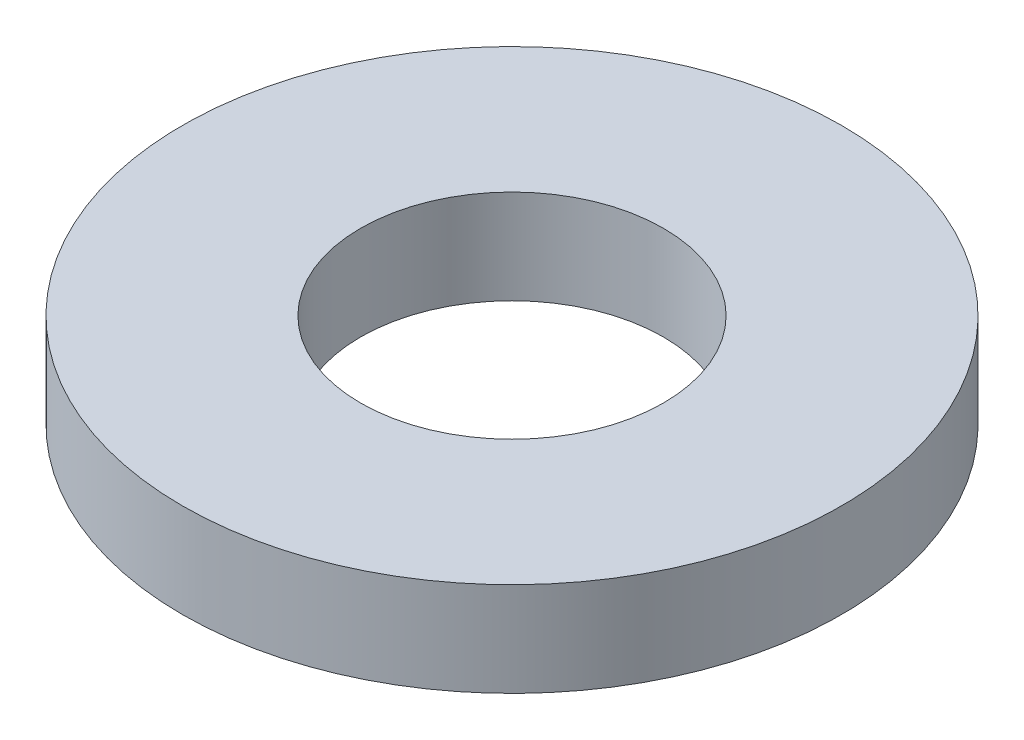
ISO-10303-21;
HEADER;
FILE_DESCRIPTION(('STEP AP214'),'2;1');
FILE_NAME('part.step','',(''),(''),'','','');
FILE_SCHEMA(('AUTOMOTIVE_DESIGN { 1 0 10303 214 1 1 1 1 }'));
ENDSEC;
DATA;
#1=APPLICATION_CONTEXT('core data for automotive mechanical design processes');
#2=APPLICATION_PROTOCOL_DEFINITION('international standard','automotive_design',2000,#1);
#3=PRODUCT_CONTEXT('',#1,'mechanical');
#4=PRODUCT('Part','Part','',(#3));
#5=PRODUCT_RELATED_PRODUCT_CATEGORY('part','',(#4));
#6=PRODUCT_DEFINITION_FORMATION('','',#4);
#7=PRODUCT_DEFINITION_CONTEXT('part definition',#1,'design');
#8=PRODUCT_DEFINITION('design','',#6,#7);
#9=PRODUCT_DEFINITION_SHAPE('','',#8);
#10=(LENGTH_UNIT() NAMED_UNIT(*) SI_UNIT(.MILLI.,.METRE.));
#11=(NAMED_UNIT(*) PLANE_ANGLE_UNIT() SI_UNIT($,.RADIAN.));
#12=(NAMED_UNIT(*) SI_UNIT($,.STERADIAN.) SOLID_ANGLE_UNIT());
#13=UNCERTAINTY_MEASURE_WITH_UNIT(LENGTH_MEASURE(1.E-05),#10,'distance_accuracy_value','');
#14=(GEOMETRIC_REPRESENTATION_CONTEXT(3) GLOBAL_UNCERTAINTY_ASSIGNED_CONTEXT((#13)) GLOBAL_UNIT_ASSIGNED_CONTEXT((#10,
#11,#12)) REPRESENTATION_CONTEXT('',''));
#15=CARTESIAN_POINT('',(0.,0.,0.));
#16=DIRECTION('',(0.,0.,1.));
#17=DIRECTION('',(1.,0.,0.));
#18=AXIS2_PLACEMENT_3D('',#15,#16,#17);
#19=CARTESIAN_POINT('',(0.,1.5875,0.));
#20=DIRECTION('',(0.,1.,0.));
#21=DIRECTION('',(0.,0.,1.));
#22=AXIS2_PLACEMENT_3D('',#19,#20,#21);
#23=PLANE('',#22);
#24=CARTESIAN_POINT('',(0.,1.5875,0.));
#25=DIRECTION('',(0.,1.,0.));
#26=DIRECTION('',(0.,0.,1.));
#27=AXIS2_PLACEMENT_3D('',#24,#25,#26);
#28=CIRCLE('',#27,5.55625);
#29=CARTESIAN_POINT('',(0.,1.5875,5.55625));
#30=VERTEX_POINT('',#29);
#31=EDGE_CURVE('E10',#30,#30,#28,.T.);
#32=ORIENTED_EDGE('',*,*,#31,.T.);
#33=EDGE_LOOP('',(#32));
#34=FACE_BOUND('',#33,.T.);
#35=CARTESIAN_POINT('',(0.,1.5875,0.));
#36=DIRECTION('',(0.,1.,0.));
#37=DIRECTION('',(0.,0.,1.));
#38=AXIS2_PLACEMENT_3D('',#35,#36,#37);
#39=CIRCLE('',#38,2.5527);
#40=CARTESIAN_POINT('',(0.,1.5875,2.5527));
#41=VERTEX_POINT('',#40);
#42=EDGE_CURVE('E56',#41,#41,#39,.T.);
#43=ORIENTED_EDGE('',*,*,#42,.F.);
#44=EDGE_LOOP('',(#43));
#45=FACE_BOUND('',#44,.T.);
#46=ADVANCED_FACE('F43',(#34,#45),#23,.T.);
#47=CARTESIAN_POINT('',(0.,0.,0.));
#48=DIRECTION('',(0.,1.,0.));
#49=DIRECTION('',(0.,0.,1.));
#50=AXIS2_PLACEMENT_3D('',#47,#48,#49);
#51=PLANE('',#50);
#52=CARTESIAN_POINT('',(0.,0.,0.));
#53=DIRECTION('',(0.,1.,0.));
#54=DIRECTION('',(0.,0.,1.));
#55=AXIS2_PLACEMENT_3D('',#52,#53,#54);
#56=CIRCLE('',#55,5.55625);
#57=CARTESIAN_POINT('',(0.,0.,5.55625));
#58=VERTEX_POINT('',#57);
#59=EDGE_CURVE('E47',#58,#58,#56,.T.);
#60=ORIENTED_EDGE('',*,*,#59,.F.);
#61=EDGE_LOOP('',(#60));
#62=FACE_BOUND('',#61,.T.);
#63=CARTESIAN_POINT('',(0.,0.,0.));
#64=DIRECTION('',(0.,1.,0.));
#65=DIRECTION('',(0.,0.,1.));
#66=AXIS2_PLACEMENT_3D('',#63,#64,#65);
#67=CIRCLE('',#66,2.5527);
#68=CARTESIAN_POINT('',(0.,0.,2.5527));
#69=VERTEX_POINT('',#68);
#70=EDGE_CURVE('E58',#69,#69,#67,.T.);
#71=ORIENTED_EDGE('',*,*,#70,.T.);
#72=EDGE_LOOP('',(#71));
#73=FACE_BOUND('',#72,.T.);
#74=ADVANCED_FACE('F70',(#62,#73),#51,.F.);
#75=CARTESIAN_POINT('',(0.,1.5875,0.));
#76=DIRECTION('',(0.,-1.,0.));
#77=DIRECTION('',(0.,0.,-1.));
#78=AXIS2_PLACEMENT_3D('',#75,#76,#77);
#79=CYLINDRICAL_SURFACE('',#78,5.55625);
#80=ORIENTED_EDGE('',*,*,#31,.F.);
#81=EDGE_LOOP('',(#80));
#82=FACE_BOUND('',#81,.T.);
#83=ORIENTED_EDGE('',*,*,#59,.T.);
#84=EDGE_LOOP('',(#83));
#85=FACE_BOUND('',#84,.T.);
#86=ADVANCED_FACE('F45',(#82,#85),#79,.T.);
#87=CARTESIAN_POINT('',(0.,1.5875,0.));
#88=DIRECTION('',(0.,-1.,0.));
#89=DIRECTION('',(0.,0.,-1.));
#90=AXIS2_PLACEMENT_3D('',#87,#88,#89);
#91=CYLINDRICAL_SURFACE('',#90,2.5527);
#92=ORIENTED_EDGE('',*,*,#42,.T.);
#93=EDGE_LOOP('',(#92));
#94=FACE_BOUND('',#93,.T.);
#95=ORIENTED_EDGE('',*,*,#70,.F.);
#96=EDGE_LOOP('',(#95));
#97=FACE_BOUND('',#96,.T.);
#98=ADVANCED_FACE('F66',(#94,#97),#91,.F.);
#99=CLOSED_SHELL('',(#46,#74,#86,#98));
#100=MANIFOLD_SOLID_BREP('B2',#99);
#101=ADVANCED_BREP_SHAPE_REPRESENTATION('',(#18,#100),#14);
#102=SHAPE_DEFINITION_REPRESENTATION(#9,#101);
ENDSEC;
END-ISO-10303-21;
